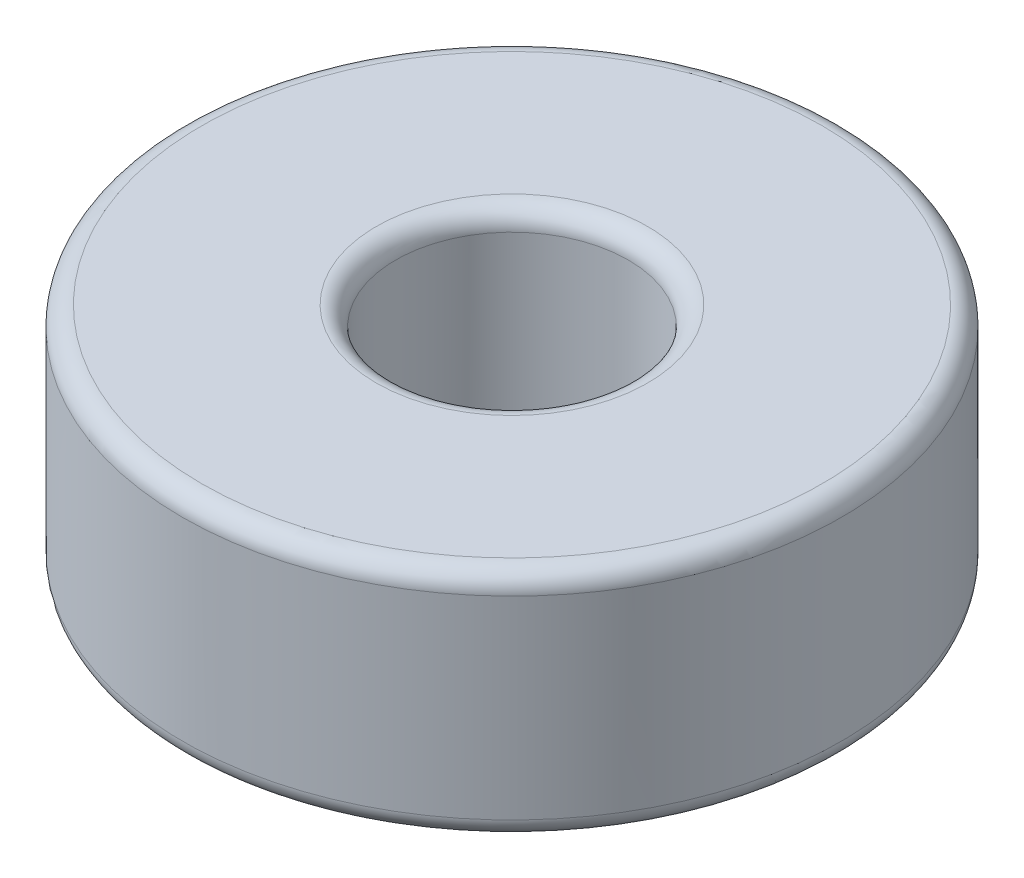
ISO-10303-21;
HEADER;
FILE_DESCRIPTION(('STEP AP214'),'2;1');
FILE_NAME('part.step','',(''),(''),'','','');
FILE_SCHEMA(('AUTOMOTIVE_DESIGN { 1 0 10303 214 1 1 1 1 }'));
ENDSEC;
DATA;
#1=APPLICATION_CONTEXT('core data for automotive mechanical design processes');
#2=APPLICATION_PROTOCOL_DEFINITION('international standard','automotive_design',2000,#1);
#3=PRODUCT_CONTEXT('',#1,'mechanical');
#4=PRODUCT('Part','Part','',(#3));
#5=PRODUCT_RELATED_PRODUCT_CATEGORY('part','',(#4));
#6=PRODUCT_DEFINITION_FORMATION('','',#4);
#7=PRODUCT_DEFINITION_CONTEXT('part definition',#1,'design');
#8=PRODUCT_DEFINITION('design','',#6,#7);
#9=PRODUCT_DEFINITION_SHAPE('','',#8);
#10=(LENGTH_UNIT() NAMED_UNIT(*) SI_UNIT(.MILLI.,.METRE.));
#11=(NAMED_UNIT(*) PLANE_ANGLE_UNIT() SI_UNIT($,.RADIAN.));
#12=(NAMED_UNIT(*) SI_UNIT($,.STERADIAN.) SOLID_ANGLE_UNIT());
#13=UNCERTAINTY_MEASURE_WITH_UNIT(LENGTH_MEASURE(1.E-05),#10,'distance_accuracy_value','');
#14=(GEOMETRIC_REPRESENTATION_CONTEXT(3) GLOBAL_UNCERTAINTY_ASSIGNED_CONTEXT((#13)) GLOBAL_UNIT_ASSIGNED_CONTEXT((#10,
#11,#12)) REPRESENTATION_CONTEXT('',''));
#15=CARTESIAN_POINT('',(0.,0.,0.));
#16=DIRECTION('',(0.,0.,1.));
#17=DIRECTION('',(1.,0.,0.));
#18=AXIS2_PLACEMENT_3D('',#15,#16,#17);
#19=CARTESIAN_POINT('',(0.,0.,0.));
#20=DIRECTION('',(0.,-1.,0.));
#21=DIRECTION('',(0.,0.,-1.));
#22=AXIS2_PLACEMENT_3D('',#19,#20,#21);
#23=CYLINDRICAL_SURFACE('',#22,3.);
#24=CARTESIAN_POINT('',(0.,0.499999999999999,0.));
#25=DIRECTION('',(0.,-1.,0.));
#26=DIRECTION('',(0.,0.,-1.));
#27=AXIS2_PLACEMENT_3D('',#24,#25,#26);
#28=CIRCLE('',#27,3.);
#29=CARTESIAN_POINT('',(0.,0.499999999999999,-3.));
#30=VERTEX_POINT('',#29);
#31=EDGE_CURVE('E59',#30,#30,#28,.T.);
#32=ORIENTED_EDGE('',*,*,#31,.T.);
#33=EDGE_LOOP('',(#32));
#34=FACE_BOUND('',#33,.T.);
#35=CARTESIAN_POINT('',(0.,5.49999999999999,0.));
#36=DIRECTION('',(0.,1.,0.));
#37=DIRECTION('',(0.,0.,1.));
#38=AXIS2_PLACEMENT_3D('',#35,#36,#37);
#39=CIRCLE('',#38,3.);
#40=CARTESIAN_POINT('',(0.,5.49999999999999,3.));
#41=VERTEX_POINT('',#40);
#42=EDGE_CURVE('E62',#41,#41,#39,.T.);
#43=ORIENTED_EDGE('',*,*,#42,.T.);
#44=EDGE_LOOP('',(#43));
#45=FACE_BOUND('',#44,.T.);
#46=ADVANCED_FACE('F33',(#34,#45),#23,.F.);
#47=CARTESIAN_POINT('',(3.,0.,0.));
#48=DIRECTION('',(0.,-1.,0.));
#49=DIRECTION('',(0.,0.,-1.));
#50=AXIS2_PLACEMENT_3D('',#47,#48,#49);
#51=PLANE('',#50);
#52=CARTESIAN_POINT('',(0.,0.,0.));
#53=DIRECTION('',(0.,-1.,0.));
#54=DIRECTION('',(0.,0.,-1.));
#55=AXIS2_PLACEMENT_3D('',#52,#53,#54);
#56=CIRCLE('',#55,3.5);
#57=CARTESIAN_POINT('',(0.,0.,-3.5));
#58=VERTEX_POINT('',#57);
#59=EDGE_CURVE('E53',#58,#58,#56,.F.);
#60=ORIENTED_EDGE('',*,*,#59,.T.);
#61=EDGE_LOOP('',(#60));
#62=FACE_BOUND('',#61,.T.);
#63=CARTESIAN_POINT('',(0.,0.,0.));
#64=DIRECTION('',(0.,-1.,0.));
#65=DIRECTION('',(0.,0.,-1.));
#66=AXIS2_PLACEMENT_3D('',#63,#64,#65);
#67=CIRCLE('',#66,8.);
#68=CARTESIAN_POINT('',(0.,0.,-8.));
#69=VERTEX_POINT('',#68);
#70=EDGE_CURVE('E56',#69,#69,#67,.T.);
#71=ORIENTED_EDGE('',*,*,#70,.T.);
#72=EDGE_LOOP('',(#71));
#73=FACE_BOUND('',#72,.T.);
#74=ADVANCED_FACE('F76',(#62,#73),#51,.T.);
#75=CARTESIAN_POINT('',(0.,0.,0.));
#76=DIRECTION('',(0.,-1.,0.));
#77=DIRECTION('',(0.,0.,-1.));
#78=AXIS2_PLACEMENT_3D('',#75,#76,#77);
#79=CYLINDRICAL_SURFACE('',#78,8.5);
#80=CARTESIAN_POINT('',(0.,0.499999999999999,0.));
#81=DIRECTION('',(0.,-1.,0.));
#82=DIRECTION('',(0.,0.,-1.));
#83=AXIS2_PLACEMENT_3D('',#80,#81,#82);
#84=CIRCLE('',#83,8.5);
#85=CARTESIAN_POINT('',(0.,0.499999999999999,-8.5));
#86=VERTEX_POINT('',#85);
#87=EDGE_CURVE('E44',#86,#86,#84,.F.);
#88=ORIENTED_EDGE('',*,*,#87,.T.);
#89=EDGE_LOOP('',(#88));
#90=FACE_BOUND('',#89,.T.);
#91=CARTESIAN_POINT('',(0.,5.49999999999999,0.));
#92=DIRECTION('',(0.,1.,0.));
#93=DIRECTION('',(0.,0.,1.));
#94=AXIS2_PLACEMENT_3D('',#91,#92,#93);
#95=CIRCLE('',#94,8.5);
#96=CARTESIAN_POINT('',(0.,5.49999999999999,8.5));
#97=VERTEX_POINT('',#96);
#98=EDGE_CURVE('E48',#97,#97,#95,.F.);
#99=ORIENTED_EDGE('',*,*,#98,.T.);
#100=EDGE_LOOP('',(#99));
#101=FACE_BOUND('',#100,.T.);
#102=ADVANCED_FACE('F82',(#90,#101),#79,.T.);
#103=CARTESIAN_POINT('',(3.,5.99999999999999,0.));
#104=DIRECTION('',(0.,1.,0.));
#105=DIRECTION('',(0.,0.,1.));
#106=AXIS2_PLACEMENT_3D('',#103,#104,#105);
#107=PLANE('',#106);
#108=CARTESIAN_POINT('',(0.,5.99999999999999,0.));
#109=DIRECTION('',(0.,1.,0.));
#110=DIRECTION('',(0.,0.,1.));
#111=AXIS2_PLACEMENT_3D('',#108,#109,#110);
#112=CIRCLE('',#111,8.);
#113=CARTESIAN_POINT('',(0.,5.99999999999999,8.));
#114=VERTEX_POINT('',#113);
#115=EDGE_CURVE('E10',#114,#114,#112,.T.);
#116=ORIENTED_EDGE('',*,*,#115,.T.);
#117=EDGE_LOOP('',(#116));
#118=FACE_BOUND('',#117,.T.);
#119=CARTESIAN_POINT('',(0.,5.99999999999999,0.));
#120=DIRECTION('',(0.,1.,0.));
#121=DIRECTION('',(0.,0.,1.));
#122=AXIS2_PLACEMENT_3D('',#119,#120,#121);
#123=CIRCLE('',#122,3.5);
#124=CARTESIAN_POINT('',(0.,5.99999999999999,3.5));
#125=VERTEX_POINT('',#124);
#126=EDGE_CURVE('E40',#125,#125,#123,.F.);
#127=ORIENTED_EDGE('',*,*,#126,.T.);
#128=EDGE_LOOP('',(#127));
#129=FACE_BOUND('',#128,.T.);
#130=ADVANCED_FACE('F90',(#118,#129),#107,.T.);
#131=CARTESIAN_POINT('',(0.,0.499999999999999,0.));
#132=DIRECTION('',(0.,-1.,0.));
#133=DIRECTION('',(0.,0.,-1.));
#134=AXIS2_PLACEMENT_3D('',#131,#132,#133);
#135=TOROIDAL_SURFACE('',#134,3.5,0.5);
#136=ORIENTED_EDGE('',*,*,#59,.F.);
#137=EDGE_LOOP('',(#136));
#138=FACE_BOUND('',#137,.T.);
#139=ORIENTED_EDGE('',*,*,#31,.F.);
#140=EDGE_LOOP('',(#139));
#141=FACE_BOUND('',#140,.T.);
#142=ADVANCED_FACE('F87',(#138,#141),#135,.T.);
#143=CARTESIAN_POINT('',(0.,0.499999999999999,0.));
#144=DIRECTION('',(0.,-1.,0.));
#145=DIRECTION('',(0.,0.,-1.));
#146=AXIS2_PLACEMENT_3D('',#143,#144,#145);
#147=TOROIDAL_SURFACE('',#146,8.,0.5);
#148=ORIENTED_EDGE('',*,*,#87,.F.);
#149=EDGE_LOOP('',(#148));
#150=FACE_BOUND('',#149,.T.);
#151=ORIENTED_EDGE('',*,*,#70,.F.);
#152=EDGE_LOOP('',(#151));
#153=FACE_BOUND('',#152,.T.);
#154=ADVANCED_FACE('F73',(#150,#153),#147,.T.);
#155=CARTESIAN_POINT('',(0.,5.49999999999999,0.));
#156=DIRECTION('',(0.,1.,0.));
#157=DIRECTION('',(0.,0.,1.));
#158=AXIS2_PLACEMENT_3D('',#155,#156,#157);
#159=TOROIDAL_SURFACE('',#158,8.,0.5);
#160=ORIENTED_EDGE('',*,*,#115,.F.);
#161=EDGE_LOOP('',(#160));
#162=FACE_BOUND('',#161,.T.);
#163=ORIENTED_EDGE('',*,*,#98,.F.);
#164=EDGE_LOOP('',(#163));
#165=FACE_BOUND('',#164,.T.);
#166=ADVANCED_FACE('F69',(#162,#165),#159,.T.);
#167=CARTESIAN_POINT('',(0.,5.49999999999999,0.));
#168=DIRECTION('',(0.,1.,0.));
#169=DIRECTION('',(0.,0.,1.));
#170=AXIS2_PLACEMENT_3D('',#167,#168,#169);
#171=TOROIDAL_SURFACE('',#170,3.5,0.5);
#172=ORIENTED_EDGE('',*,*,#42,.F.);
#173=EDGE_LOOP('',(#172));
#174=FACE_BOUND('',#173,.T.);
#175=ORIENTED_EDGE('',*,*,#126,.F.);
#176=EDGE_LOOP('',(#175));
#177=FACE_BOUND('',#176,.T.);
#178=ADVANCED_FACE('F35',(#174,#177),#171,.T.);
#179=CLOSED_SHELL('',(#46,#74,#102,#130,#142,#154,#166,#178));
#180=MANIFOLD_SOLID_BREP('B2',#179);
#181=ADVANCED_BREP_SHAPE_REPRESENTATION('',(#18,#180),#14);
#182=SHAPE_DEFINITION_REPRESENTATION(#9,#181);
ENDSEC;
END-ISO-10303-21;
